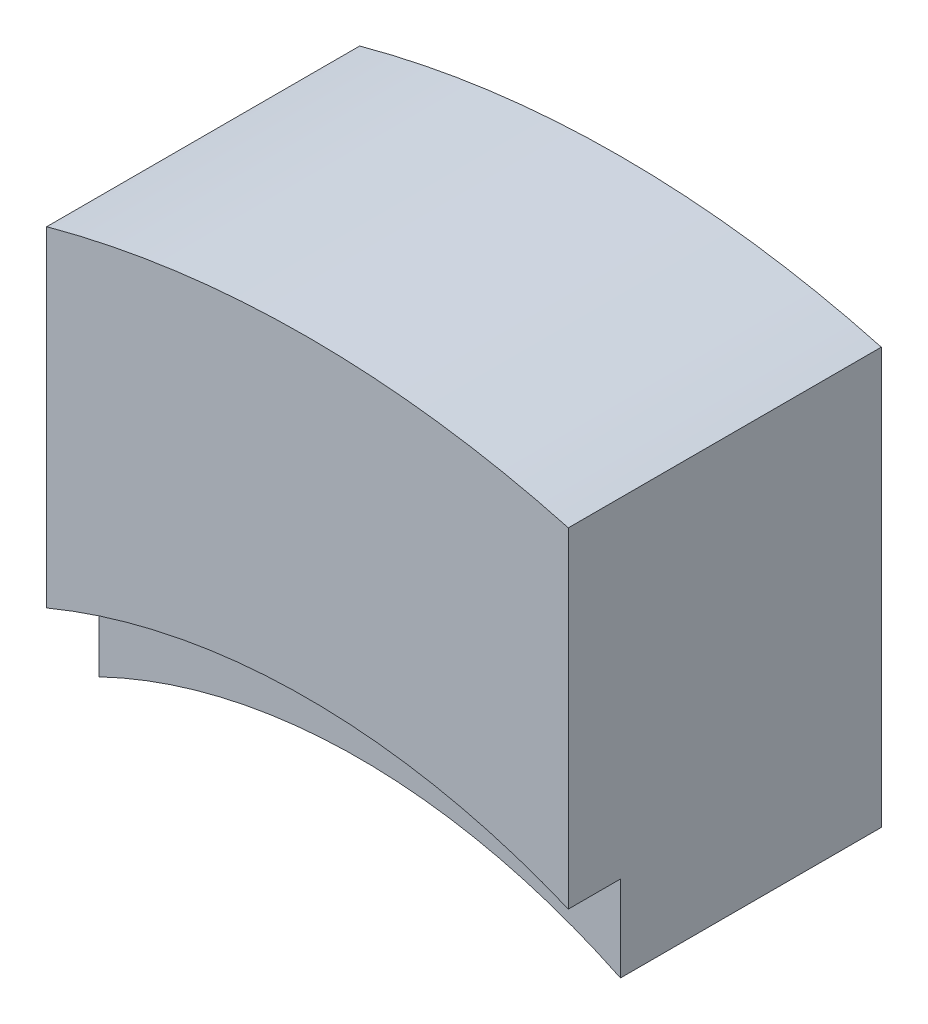
ISO-10303-21;
HEADER;
FILE_DESCRIPTION(('STEP AP214'),'2;1');
FILE_NAME('part.step','',(''),(''),'','','');
FILE_SCHEMA(('AUTOMOTIVE_DESIGN { 1 0 10303 214 1 1 1 1 }'));
ENDSEC;
DATA;
#1=APPLICATION_CONTEXT('core data for automotive mechanical design processes');
#2=APPLICATION_PROTOCOL_DEFINITION('international standard','automotive_design',2000,#1);
#3=PRODUCT_CONTEXT('',#1,'mechanical');
#4=PRODUCT('Part','Part','',(#3));
#5=PRODUCT_RELATED_PRODUCT_CATEGORY('part','',(#4));
#6=PRODUCT_DEFINITION_FORMATION('','',#4);
#7=PRODUCT_DEFINITION_CONTEXT('part definition',#1,'design');
#8=PRODUCT_DEFINITION('design','',#6,#7);
#9=PRODUCT_DEFINITION_SHAPE('','',#8);
#10=(LENGTH_UNIT() NAMED_UNIT(*) SI_UNIT(.MILLI.,.METRE.));
#11=(NAMED_UNIT(*) PLANE_ANGLE_UNIT() SI_UNIT($,.RADIAN.));
#12=(NAMED_UNIT(*) SI_UNIT($,.STERADIAN.) SOLID_ANGLE_UNIT());
#13=UNCERTAINTY_MEASURE_WITH_UNIT(LENGTH_MEASURE(1.E-05),#10,'distance_accuracy_value','');
#14=(GEOMETRIC_REPRESENTATION_CONTEXT(3) GLOBAL_UNCERTAINTY_ASSIGNED_CONTEXT((#13)) GLOBAL_UNIT_ASSIGNED_CONTEXT((#10,
#11,#12)) REPRESENTATION_CONTEXT('',''));
#15=CARTESIAN_POINT('',(0.,0.,0.));
#16=DIRECTION('',(0.,0.,1.));
#17=DIRECTION('',(1.,0.,0.));
#18=AXIS2_PLACEMENT_3D('',#15,#16,#17);
#19=CARTESIAN_POINT('',(0.,0.,25.));
#20=DIRECTION('',(0.,0.,-1.));
#21=DIRECTION('',(-1.,0.,0.));
#22=AXIS2_PLACEMENT_3D('',#19,#20,#21);
#23=PLANE('',#22);
#24=CARTESIAN_POINT('',(0.,0.,25.));
#25=DIRECTION('',(0.,0.,-1.));
#26=DIRECTION('',(-1.,0.,0.));
#27=AXIS2_PLACEMENT_3D('',#24,#25,#26);
#28=CIRCLE('',#27,64.999999999994);
#29=CARTESIAN_POINT('',(-25.,59.9999999999935,25.));
#30=VERTEX_POINT('',#29);
#31=CARTESIAN_POINT('',(25.,59.9999999999935,25.));
#32=VERTEX_POINT('',#31);
#33=EDGE_CURVE('E94',#30,#32,#28,.T.);
#34=ORIENTED_EDGE('',*,*,#33,.F.);
#35=DIRECTION('',(0.,-1.,0.));
#36=VECTOR('',#35,1.);
#37=CARTESIAN_POINT('',(-25.,91.6515138991106,25.));
#38=LINE('',#37,#36);
#39=CARTESIAN_POINT('',(-25.,51.7807879430133,25.));
#40=VERTEX_POINT('',#39);
#41=EDGE_CURVE('E46',#30,#40,#38,.T.);
#42=ORIENTED_EDGE('',*,*,#41,.T.);
#43=CARTESIAN_POINT('',(0.,0.,25.));
#44=DIRECTION('',(0.,0.,-1.));
#45=DIRECTION('',(1.,0.,0.));
#46=AXIS2_PLACEMENT_3D('',#43,#44,#45);
#47=CIRCLE('',#46,57.499999999994);
#48=CARTESIAN_POINT('',(25.,51.7807879430133,25.));
#49=VERTEX_POINT('',#48);
#50=EDGE_CURVE('E82',#40,#49,#47,.T.);
#51=ORIENTED_EDGE('',*,*,#50,.T.);
#52=DIRECTION('',(0.,1.,0.));
#53=VECTOR('',#52,1.);
#54=CARTESIAN_POINT('',(25.,51.7807879430133,25.));
#55=LINE('',#54,#53);
#56=EDGE_CURVE('E38',#49,#32,#55,.T.);
#57=ORIENTED_EDGE('',*,*,#56,.T.);
#58=EDGE_LOOP('',(#34,#42,#51,#57));
#59=FACE_BOUND('',#58,.T.);
#60=ADVANCED_FACE('F17',(#59),#23,.F.);
#61=CARTESIAN_POINT('',(0.,0.,25.));
#62=DIRECTION('',(0.,0.,-1.));
#63=DIRECTION('',(-1.,0.,0.));
#64=AXIS2_PLACEMENT_3D('',#61,#62,#63);
#65=CYLINDRICAL_SURFACE('',#64,57.499999999994);
#66=CARTESIAN_POINT('',(0.,0.,0.));
#67=DIRECTION('',(0.,0.,-1.));
#68=DIRECTION('',(1.,0.,0.));
#69=AXIS2_PLACEMENT_3D('',#66,#67,#68);
#70=CIRCLE('',#69,57.499999999994);
#71=CARTESIAN_POINT('',(-25.,51.7807879430133,0.));
#72=VERTEX_POINT('',#71);
#73=CARTESIAN_POINT('',(25.,51.7807879430133,0.));
#74=VERTEX_POINT('',#73);
#75=EDGE_CURVE('E88',#72,#74,#70,.T.);
#76=ORIENTED_EDGE('',*,*,#75,.T.);
#77=DIRECTION('',(0.,0.,-1.));
#78=VECTOR('',#77,1.);
#79=CARTESIAN_POINT('',(25.,51.7807879430133,25.));
#80=LINE('',#79,#78);
#81=EDGE_CURVE('E11',#49,#74,#80,.T.);
#82=ORIENTED_EDGE('',*,*,#81,.F.);
#83=ORIENTED_EDGE('',*,*,#50,.F.);
#84=DIRECTION('',(0.,0.,-1.));
#85=VECTOR('',#84,1.);
#86=CARTESIAN_POINT('',(-25.,51.7807879430133,25.));
#87=LINE('',#86,#85);
#88=EDGE_CURVE('E73',#40,#72,#87,.T.);
#89=ORIENTED_EDGE('',*,*,#88,.T.);
#90=EDGE_LOOP('',(#76,#82,#83,#89));
#91=FACE_BOUND('',#90,.T.);
#92=ADVANCED_FACE('F19',(#91),#65,.F.);
#93=CARTESIAN_POINT('',(25.,51.7807879430133,25.));
#94=DIRECTION('',(-1.,0.,0.));
#95=DIRECTION('',(0.,-1.,0.));
#96=AXIS2_PLACEMENT_3D('',#93,#94,#95);
#97=PLANE('',#96);
#98=DIRECTION('',(0.,0.,-1.));
#99=VECTOR('',#98,1.);
#100=CARTESIAN_POINT('',(25.,91.6515138991106,25.));
#101=LINE('',#100,#99);
#102=CARTESIAN_POINT('',(25.,91.6515138991106,30.));
#103=VERTEX_POINT('',#102);
#104=CARTESIAN_POINT('',(25.,91.6515138991106,0.));
#105=VERTEX_POINT('',#104);
#106=EDGE_CURVE('E26',#103,#105,#101,.T.);
#107=ORIENTED_EDGE('',*,*,#106,.F.);
#108=DIRECTION('',(0.,1.,0.));
#109=VECTOR('',#108,1.);
#110=CARTESIAN_POINT('',(25.,59.9999999999935,30.));
#111=LINE('',#110,#109);
#112=CARTESIAN_POINT('',(25.,59.9999999999935,30.));
#113=VERTEX_POINT('',#112);
#114=EDGE_CURVE('E138',#113,#103,#111,.T.);
#115=ORIENTED_EDGE('',*,*,#114,.F.);
#116=DIRECTION('',(0.,0.,-1.));
#117=VECTOR('',#116,1.);
#118=CARTESIAN_POINT('',(25.,59.9999999999935,30.));
#119=LINE('',#118,#117);
#120=EDGE_CURVE('E100',#113,#32,#119,.T.);
#121=ORIENTED_EDGE('',*,*,#120,.T.);
#122=ORIENTED_EDGE('',*,*,#56,.F.);
#123=ORIENTED_EDGE('',*,*,#81,.T.);
#124=DIRECTION('',(0.,1.,0.));
#125=VECTOR('',#124,1.);
#126=CARTESIAN_POINT('',(25.,51.7807879430133,0.));
#127=LINE('',#126,#125);
#128=EDGE_CURVE('E92',#74,#105,#127,.T.);
#129=ORIENTED_EDGE('',*,*,#128,.T.);
#130=EDGE_LOOP('',(#107,#115,#121,#122,#123,#129));
#131=FACE_BOUND('',#130,.T.);
#132=ADVANCED_FACE('F154',(#131),#97,.F.);
#133=CARTESIAN_POINT('',(0.,0.,25.));
#134=DIRECTION('',(0.,0.,-1.));
#135=DIRECTION('',(-1.,0.,0.));
#136=AXIS2_PLACEMENT_3D('',#133,#134,#135);
#137=CYLINDRICAL_SURFACE('',#136,94.999999999994);
#138=CARTESIAN_POINT('',(0.,0.,0.));
#139=DIRECTION('',(0.,0.,1.));
#140=DIRECTION('',(1.,0.,0.));
#141=AXIS2_PLACEMENT_3D('',#138,#139,#140);
#142=CIRCLE('',#141,94.999999999994);
#143=CARTESIAN_POINT('',(-25.,91.6515138991106,0.));
#144=VERTEX_POINT('',#143);
#145=EDGE_CURVE('E83',#105,#144,#142,.T.);
#146=ORIENTED_EDGE('',*,*,#145,.T.);
#147=DIRECTION('',(0.,0.,-1.));
#148=VECTOR('',#147,1.);
#149=CARTESIAN_POINT('',(-25.,91.6515138991106,25.));
#150=LINE('',#149,#148);
#151=CARTESIAN_POINT('',(-25.,91.6515138991106,30.));
#152=VERTEX_POINT('',#151);
#153=EDGE_CURVE('E77',#152,#144,#150,.T.);
#154=ORIENTED_EDGE('',*,*,#153,.F.);
#155=CARTESIAN_POINT('',(0.,0.,30.));
#156=DIRECTION('',(0.,0.,1.));
#157=DIRECTION('',(1.,0.,0.));
#158=AXIS2_PLACEMENT_3D('',#155,#156,#157);
#159=CIRCLE('',#158,94.999999999994);
#160=EDGE_CURVE('E114',#103,#152,#159,.T.);
#161=ORIENTED_EDGE('',*,*,#160,.F.);
#162=ORIENTED_EDGE('',*,*,#106,.T.);
#163=EDGE_LOOP('',(#146,#154,#161,#162));
#164=FACE_BOUND('',#163,.T.);
#165=ADVANCED_FACE('F111',(#164),#137,.T.);
#166=CARTESIAN_POINT('',(-25.,91.6515138991106,25.));
#167=DIRECTION('',(1.,0.,0.));
#168=DIRECTION('',(0.,1.,0.));
#169=AXIS2_PLACEMENT_3D('',#166,#167,#168);
#170=PLANE('',#169);
#171=DIRECTION('',(0.,-1.,0.));
#172=VECTOR('',#171,1.);
#173=CARTESIAN_POINT('',(-25.,91.6515138991106,0.));
#174=LINE('',#173,#172);
#175=EDGE_CURVE('E70',#144,#72,#174,.T.);
#176=ORIENTED_EDGE('',*,*,#175,.T.);
#177=ORIENTED_EDGE('',*,*,#88,.F.);
#178=ORIENTED_EDGE('',*,*,#41,.F.);
#179=DIRECTION('',(0.,0.,-1.));
#180=VECTOR('',#179,1.);
#181=CARTESIAN_POINT('',(-25.,59.9999999999935,30.));
#182=LINE('',#181,#180);
#183=CARTESIAN_POINT('',(-25.,59.9999999999935,30.));
#184=VERTEX_POINT('',#183);
#185=EDGE_CURVE('E130',#184,#30,#182,.T.);
#186=ORIENTED_EDGE('',*,*,#185,.F.);
#187=DIRECTION('',(0.,-1.,0.));
#188=VECTOR('',#187,1.);
#189=CARTESIAN_POINT('',(-25.,91.6515138991106,30.));
#190=LINE('',#189,#188);
#191=EDGE_CURVE('E134',#152,#184,#190,.T.);
#192=ORIENTED_EDGE('',*,*,#191,.F.);
#193=ORIENTED_EDGE('',*,*,#153,.T.);
#194=EDGE_LOOP('',(#176,#177,#178,#186,#192,#193));
#195=FACE_BOUND('',#194,.T.);
#196=ADVANCED_FACE('F72',(#195),#170,.F.);
#197=CARTESIAN_POINT('',(0.,0.,0.));
#198=DIRECTION('',(0.,0.,-1.));
#199=DIRECTION('',(-1.,0.,0.));
#200=AXIS2_PLACEMENT_3D('',#197,#198,#199);
#201=PLANE('',#200);
#202=ORIENTED_EDGE('',*,*,#145,.F.);
#203=ORIENTED_EDGE('',*,*,#128,.F.);
#204=ORIENTED_EDGE('',*,*,#75,.F.);
#205=ORIENTED_EDGE('',*,*,#175,.F.);
#206=EDGE_LOOP('',(#202,#203,#204,#205));
#207=FACE_BOUND('',#206,.T.);
#208=ADVANCED_FACE('F91',(#207),#201,.T.);
#209=CARTESIAN_POINT('',(0.,0.,30.));
#210=DIRECTION('',(0.,0.,-1.));
#211=DIRECTION('',(-1.,0.,0.));
#212=AXIS2_PLACEMENT_3D('',#209,#210,#211);
#213=CYLINDRICAL_SURFACE('',#212,64.999999999994);
#214=ORIENTED_EDGE('',*,*,#185,.T.);
#215=ORIENTED_EDGE('',*,*,#33,.T.);
#216=ORIENTED_EDGE('',*,*,#120,.F.);
#217=CARTESIAN_POINT('',(0.,0.,30.));
#218=DIRECTION('',(0.,0.,-1.));
#219=DIRECTION('',(1.,0.,0.));
#220=AXIS2_PLACEMENT_3D('',#217,#218,#219);
#221=CIRCLE('',#220,64.999999999994);
#222=EDGE_CURVE('E135',#184,#113,#221,.T.);
#223=ORIENTED_EDGE('',*,*,#222,.F.);
#224=EDGE_LOOP('',(#214,#215,#216,#223));
#225=FACE_BOUND('',#224,.T.);
#226=ADVANCED_FACE('F167',(#225),#213,.F.);
#227=CARTESIAN_POINT('',(0.,0.,30.));
#228=DIRECTION('',(0.,0.,-1.));
#229=DIRECTION('',(-1.,0.,0.));
#230=AXIS2_PLACEMENT_3D('',#227,#228,#229);
#231=PLANE('',#230);
#232=ORIENTED_EDGE('',*,*,#222,.T.);
#233=ORIENTED_EDGE('',*,*,#114,.T.);
#234=ORIENTED_EDGE('',*,*,#160,.T.);
#235=ORIENTED_EDGE('',*,*,#191,.T.);
#236=EDGE_LOOP('',(#232,#233,#234,#235));
#237=FACE_BOUND('',#236,.T.);
#238=ADVANCED_FACE('F147',(#237),#231,.F.);
#239=CLOSED_SHELL('',(#60,#92,#132,#165,#196,#208,#226,#238));
#240=MANIFOLD_SOLID_BREP('B1',#239);
#241=ADVANCED_BREP_SHAPE_REPRESENTATION('',(#18,#240),#14);
#242=SHAPE_DEFINITION_REPRESENTATION(#9,#241);
ENDSEC;
END-ISO-10303-21;
